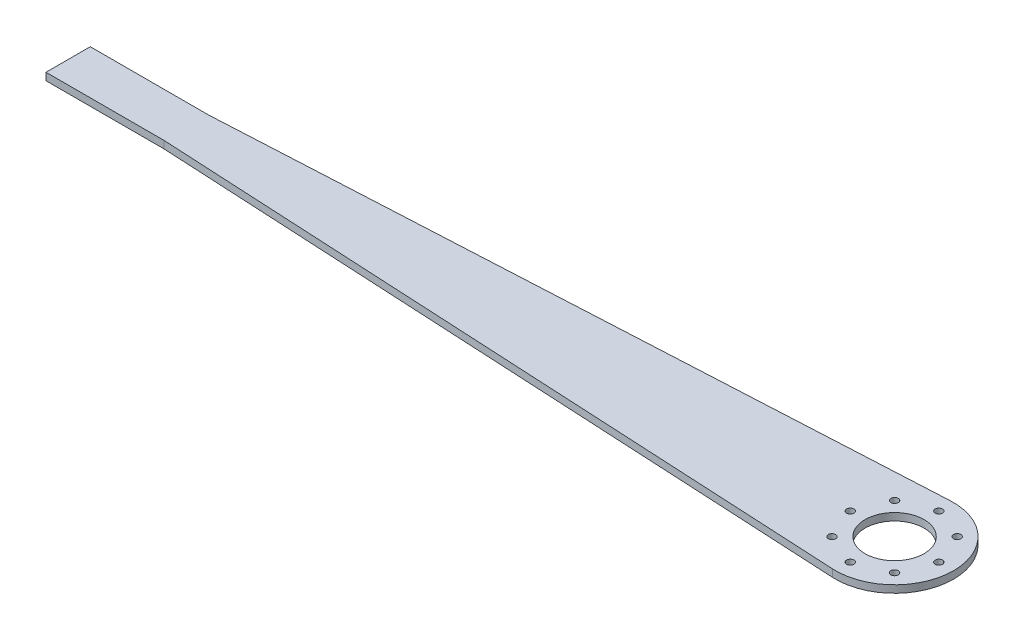
ISO-10303-21;
HEADER;
FILE_DESCRIPTION(('STEP AP214'),'2;1');
FILE_NAME('part.step','',(''),(''),'','','');
FILE_SCHEMA(('AUTOMOTIVE_DESIGN { 1 0 10303 214 1 1 1 1 }'));
ENDSEC;
DATA;
#1=APPLICATION_CONTEXT('core data for automotive mechanical design processes');
#2=APPLICATION_PROTOCOL_DEFINITION('international standard','automotive_design',2000,#1);
#3=PRODUCT_CONTEXT('',#1,'mechanical');
#4=PRODUCT('Part','Part','',(#3));
#5=PRODUCT_RELATED_PRODUCT_CATEGORY('part','',(#4));
#6=PRODUCT_DEFINITION_FORMATION('','',#4);
#7=PRODUCT_DEFINITION_CONTEXT('part definition',#1,'design');
#8=PRODUCT_DEFINITION('design','',#6,#7);
#9=PRODUCT_DEFINITION_SHAPE('','',#8);
#10=(LENGTH_UNIT() NAMED_UNIT(*) SI_UNIT(.MILLI.,.METRE.));
#11=(NAMED_UNIT(*) PLANE_ANGLE_UNIT() SI_UNIT($,.RADIAN.));
#12=(NAMED_UNIT(*) SI_UNIT($,.STERADIAN.) SOLID_ANGLE_UNIT());
#13=UNCERTAINTY_MEASURE_WITH_UNIT(LENGTH_MEASURE(1.E-05),#10,'distance_accuracy_value','');
#14=(GEOMETRIC_REPRESENTATION_CONTEXT(3) GLOBAL_UNCERTAINTY_ASSIGNED_CONTEXT((#13)) GLOBAL_UNIT_ASSIGNED_CONTEXT((#10,
#11,#12)) REPRESENTATION_CONTEXT('',''));
#15=CARTESIAN_POINT('',(0.,0.,0.));
#16=DIRECTION('',(0.,0.,1.));
#17=DIRECTION('',(1.,0.,0.));
#18=AXIS2_PLACEMENT_3D('',#15,#16,#17);
#19=CARTESIAN_POINT('',(-944.944647828686,6.35,-11.0296410004954));
#20=DIRECTION('',(0.,-1.,0.));
#21=DIRECTION('',(0.,0.,-1.));
#22=AXIS2_PLACEMENT_3D('',#19,#20,#21);
#23=CYLINDRICAL_SURFACE('',#22,50.8);
#24=CARTESIAN_POINT('',(-944.944647828686,0.,-11.0296410004954));
#25=DIRECTION('',(0.,1.,0.));
#26=DIRECTION('',(0.,0.,-1.));
#27=AXIS2_PLACEMENT_3D('',#24,#25,#26);
#28=CIRCLE('',#27,50.8);
#29=CARTESIAN_POINT('',(-947.592639327756,0.,39.7012976959337));
#30=VERTEX_POINT('',#29);
#31=CARTESIAN_POINT('',(-947.592639327756,0.,-61.7605796969246));
#32=VERTEX_POINT('',#31);
#33=EDGE_CURVE('E123',#30,#32,#28,.T.);
#34=ORIENTED_EDGE('',*,*,#33,.T.);
#35=DIRECTION('',(0.,-1.,0.));
#36=VECTOR('',#35,1.);
#37=CARTESIAN_POINT('',(-947.592639327756,6.35,-61.7605796969246));
#38=LINE('',#37,#36);
#39=CARTESIAN_POINT('',(-947.592639327756,6.35,-61.7605796969246));
#40=VERTEX_POINT('',#39);
#41=EDGE_CURVE('E11',#40,#32,#38,.T.);
#42=ORIENTED_EDGE('',*,*,#41,.F.);
#43=CARTESIAN_POINT('',(-944.944647828686,6.35,-11.0296410004954));
#44=DIRECTION('',(0.,1.,0.));
#45=DIRECTION('',(0.,0.,-1.));
#46=AXIS2_PLACEMENT_3D('',#43,#44,#45);
#47=CIRCLE('',#46,50.8);
#48=CARTESIAN_POINT('',(-947.592639327756,6.35,39.7012976959337));
#49=VERTEX_POINT('',#48);
#50=EDGE_CURVE('E134',#49,#40,#47,.T.);
#51=ORIENTED_EDGE('',*,*,#50,.F.);
#52=DIRECTION('',(0.,-1.,0.));
#53=VECTOR('',#52,1.);
#54=CARTESIAN_POINT('',(-947.592639327756,6.35,39.7012976959337));
#55=LINE('',#54,#53);
#56=EDGE_CURVE('E119',#49,#30,#55,.T.);
#57=ORIENTED_EDGE('',*,*,#56,.T.);
#58=EDGE_LOOP('',(#34,#42,#51,#57));
#59=FACE_BOUND('',#58,.T.);
#60=ADVANCED_FACE('F39',(#59),#23,.T.);
#61=CARTESIAN_POINT('',(-947.592639327756,6.35,-61.7605796969246));
#62=DIRECTION('',(0.0521258169108252,0.,0.998640525520259));
#63=DIRECTION('',(0.998640525520259,0.,-0.0521258169108252));
#64=AXIS2_PLACEMENT_3D('',#61,#62,#63);
#65=PLANE('',#64);
#66=DIRECTION('',(-0.998640525520259,0.,0.0521258169108252));
#67=VECTOR('',#66,1.);
#68=CARTESIAN_POINT('',(-947.592639327756,0.,-61.7605796969246));
#69=LINE('',#68,#67);
#70=CARTESIAN_POINT('',(-1554.54464782869,0.,-30.0796410004955));
#71=VERTEX_POINT('',#70);
#72=EDGE_CURVE('E126',#32,#71,#69,.T.);
#73=ORIENTED_EDGE('',*,*,#72,.T.);
#74=DIRECTION('',(0.,-1.,0.));
#75=VECTOR('',#74,1.);
#76=CARTESIAN_POINT('',(-1554.54464782869,6.35,-30.0796410004955));
#77=LINE('',#76,#75);
#78=CARTESIAN_POINT('',(-1554.54464782869,6.35,-30.0796410004955));
#79=VERTEX_POINT('',#78);
#80=EDGE_CURVE('E47',#79,#71,#77,.T.);
#81=ORIENTED_EDGE('',*,*,#80,.F.);
#82=DIRECTION('',(-0.998640525520259,0.,0.0521258169108252));
#83=VECTOR('',#82,1.);
#84=CARTESIAN_POINT('',(-947.592639327756,6.35,-61.7605796969246));
#85=LINE('',#84,#83);
#86=EDGE_CURVE('E92',#40,#79,#85,.T.);
#87=ORIENTED_EDGE('',*,*,#86,.F.);
#88=ORIENTED_EDGE('',*,*,#41,.T.);
#89=EDGE_LOOP('',(#73,#81,#87,#88));
#90=FACE_BOUND('',#89,.T.);
#91=ADVANCED_FACE('F160',(#90),#65,.F.);
#92=CARTESIAN_POINT('',(-1554.54464782869,6.35,-30.0796410004955));
#93=DIRECTION('',(0.,0.,1.));
#94=DIRECTION('',(1.,0.,0.));
#95=AXIS2_PLACEMENT_3D('',#92,#93,#94);
#96=PLANE('',#95);
#97=DIRECTION('',(-1.,0.,0.));
#98=VECTOR('',#97,1.);
#99=CARTESIAN_POINT('',(-1554.54464782869,0.,-30.0796410004955));
#100=LINE('',#99,#98);
#101=CARTESIAN_POINT('',(-1656.14464782869,0.,-30.0796410004954));
#102=VERTEX_POINT('',#101);
#103=EDGE_CURVE('E129',#71,#102,#100,.T.);
#104=ORIENTED_EDGE('',*,*,#103,.T.);
#105=DIRECTION('',(0.,-1.,0.));
#106=VECTOR('',#105,1.);
#107=CARTESIAN_POINT('',(-1656.14464782869,6.35,-30.0796410004954));
#108=LINE('',#107,#106);
#109=CARTESIAN_POINT('',(-1656.14464782869,6.35,-30.0796410004954));
#110=VERTEX_POINT('',#109);
#111=EDGE_CURVE('E114',#110,#102,#108,.T.);
#112=ORIENTED_EDGE('',*,*,#111,.F.);
#113=DIRECTION('',(-1.,0.,0.));
#114=VECTOR('',#113,1.);
#115=CARTESIAN_POINT('',(-1554.54464782869,6.35,-30.0796410004955));
#116=LINE('',#115,#114);
#117=EDGE_CURVE('E105',#79,#110,#116,.T.);
#118=ORIENTED_EDGE('',*,*,#117,.F.);
#119=ORIENTED_EDGE('',*,*,#80,.T.);
#120=EDGE_LOOP('',(#104,#112,#118,#119));
#121=FACE_BOUND('',#120,.T.);
#122=ADVANCED_FACE('F140',(#121),#96,.F.);
#123=CARTESIAN_POINT('',(-1656.14464782869,6.35,-30.0796410004954));
#124=DIRECTION('',(1.,0.,0.));
#125=DIRECTION('',(0.,0.,-1.));
#126=AXIS2_PLACEMENT_3D('',#123,#124,#125);
#127=PLANE('',#126);
#128=DIRECTION('',(0.,0.,1.));
#129=VECTOR('',#128,1.);
#130=CARTESIAN_POINT('',(-1656.14464782869,0.,-30.0796410004954));
#131=LINE('',#130,#129);
#132=CARTESIAN_POINT('',(-1656.14464782869,0.,8.02035899950456));
#133=VERTEX_POINT('',#132);
#134=EDGE_CURVE('E113',#102,#133,#131,.T.);
#135=ORIENTED_EDGE('',*,*,#134,.T.);
#136=DIRECTION('',(0.,-1.,0.));
#137=VECTOR('',#136,1.);
#138=CARTESIAN_POINT('',(-1656.14464782869,6.35,8.02035899950456));
#139=LINE('',#138,#137);
#140=CARTESIAN_POINT('',(-1656.14464782869,6.35,8.02035899950456));
#141=VERTEX_POINT('',#140);
#142=EDGE_CURVE('E110',#141,#133,#139,.T.);
#143=ORIENTED_EDGE('',*,*,#142,.F.);
#144=DIRECTION('',(0.,0.,1.));
#145=VECTOR('',#144,1.);
#146=CARTESIAN_POINT('',(-1656.14464782869,6.35,-30.0796410004954));
#147=LINE('',#146,#145);
#148=EDGE_CURVE('E99',#110,#141,#147,.T.);
#149=ORIENTED_EDGE('',*,*,#148,.F.);
#150=ORIENTED_EDGE('',*,*,#111,.T.);
#151=EDGE_LOOP('',(#135,#143,#149,#150));
#152=FACE_BOUND('',#151,.T.);
#153=ADVANCED_FACE('F111',(#152),#127,.F.);
#154=CARTESIAN_POINT('',(-1656.14464782869,6.35,8.02035899950456));
#155=DIRECTION('',(0.,0.,-1.));
#156=DIRECTION('',(-1.,0.,0.));
#157=AXIS2_PLACEMENT_3D('',#154,#155,#156);
#158=PLANE('',#157);
#159=DIRECTION('',(1.,0.,0.));
#160=VECTOR('',#159,1.);
#161=CARTESIAN_POINT('',(-1656.14464782869,0.,8.02035899950456));
#162=LINE('',#161,#160);
#163=CARTESIAN_POINT('',(-1554.54464782869,0.,8.02035899950456));
#164=VERTEX_POINT('',#163);
#165=EDGE_CURVE('E78',#133,#164,#162,.T.);
#166=ORIENTED_EDGE('',*,*,#165,.T.);
#167=DIRECTION('',(0.,-1.,0.));
#168=VECTOR('',#167,1.);
#169=CARTESIAN_POINT('',(-1554.54464782869,6.35,8.02035899950456));
#170=LINE('',#169,#168);
#171=CARTESIAN_POINT('',(-1554.54464782869,6.35,8.02035899950456));
#172=VERTEX_POINT('',#171);
#173=EDGE_CURVE('E115',#172,#164,#170,.T.);
#174=ORIENTED_EDGE('',*,*,#173,.F.);
#175=DIRECTION('',(1.,0.,0.));
#176=VECTOR('',#175,1.);
#177=CARTESIAN_POINT('',(-1656.14464782869,6.35,8.02035899950456));
#178=LINE('',#177,#176);
#179=EDGE_CURVE('E103',#141,#172,#178,.T.);
#180=ORIENTED_EDGE('',*,*,#179,.F.);
#181=ORIENTED_EDGE('',*,*,#142,.T.);
#182=EDGE_LOOP('',(#166,#174,#180,#181));
#183=FACE_BOUND('',#182,.T.);
#184=ADVANCED_FACE('F117',(#183),#158,.F.);
#185=CARTESIAN_POINT('',(-1554.54464782869,6.35,8.02035899950456));
#186=DIRECTION('',(0.0521258169108252,0.,-0.998640525520259));
#187=DIRECTION('',(-0.998640525520259,0.,-0.0521258169108252));
#188=AXIS2_PLACEMENT_3D('',#185,#186,#187);
#189=PLANE('',#188);
#190=DIRECTION('',(0.998640525520259,0.,0.0521258169108252));
#191=VECTOR('',#190,1.);
#192=CARTESIAN_POINT('',(-1554.54464782869,0.,8.02035899950456));
#193=LINE('',#192,#191);
#194=EDGE_CURVE('E84',#164,#30,#193,.T.);
#195=ORIENTED_EDGE('',*,*,#194,.T.);
#196=ORIENTED_EDGE('',*,*,#56,.F.);
#197=DIRECTION('',(0.998640525520259,0.,0.0521258169108252));
#198=VECTOR('',#197,1.);
#199=CARTESIAN_POINT('',(-1554.54464782869,6.35,8.02035899950456));
#200=LINE('',#199,#198);
#201=EDGE_CURVE('E55',#172,#49,#200,.T.);
#202=ORIENTED_EDGE('',*,*,#201,.F.);
#203=ORIENTED_EDGE('',*,*,#173,.T.);
#204=EDGE_LOOP('',(#195,#196,#202,#203));
#205=FACE_BOUND('',#204,.T.);
#206=ADVANCED_FACE('F147',(#205),#189,.F.);
#207=CARTESIAN_POINT('',(-944.944647828686,6.35,-11.0296410004954));
#208=DIRECTION('',(0.,-1.,0.));
#209=DIRECTION('',(0.,0.,-1.));
#210=AXIS2_PLACEMENT_3D('',#207,#208,#209);
#211=PLANE('',#210);
#212=CARTESIAN_POINT('',(-983.044647828686,6.35,-11.0296410004952));
#213=DIRECTION('',(0.,1.,0.));
#214=DIRECTION('',(1.,0.,0.));
#215=AXIS2_PLACEMENT_3D('',#212,#213,#214);
#216=CIRCLE('',#215,3.17500000000004);
#217=CARTESIAN_POINT('',(-979.869647828686,6.35,-11.0296410004952));
#218=VERTEX_POINT('',#217);
#219=EDGE_CURVE('E269',#218,#218,#216,.T.);
#220=ORIENTED_EDGE('',*,*,#219,.F.);
#221=EDGE_LOOP('',(#220));
#222=FACE_BOUND('',#221,.T.);
#223=CARTESIAN_POINT('',(-971.885416191894,6.35,15.9111273627122));
#224=DIRECTION('',(0.,1.,0.));
#225=DIRECTION('',(0.707106781186544,0.,-0.707106781186551));
#226=AXIS2_PLACEMENT_3D('',#223,#224,#225);
#227=CIRCLE('',#226,3.17500000000004);
#228=CARTESIAN_POINT('',(-969.640352161627,6.35,13.6660633324448));
#229=VERTEX_POINT('',#228);
#230=EDGE_CURVE('E275',#229,#229,#227,.T.);
#231=ORIENTED_EDGE('',*,*,#230,.F.);
#232=EDGE_LOOP('',(#231));
#233=FACE_BOUND('',#232,.T.);
#234=CARTESIAN_POINT('',(-944.944647828686,6.35,27.0703589995046));
#235=DIRECTION('',(0.,1.,0.));
#236=DIRECTION('',(0.,0.,-1.));
#237=AXIS2_PLACEMENT_3D('',#234,#235,#236);
#238=CIRCLE('',#237,3.17500000000004);
#239=CARTESIAN_POINT('',(-944.944647828686,6.35,23.8953589995045));
#240=VERTEX_POINT('',#239);
#241=EDGE_CURVE('E282',#240,#240,#238,.T.);
#242=ORIENTED_EDGE('',*,*,#241,.F.);
#243=EDGE_LOOP('',(#242));
#244=FACE_BOUND('',#243,.T.);
#245=CARTESIAN_POINT('',(-918.003879465479,6.35,15.9111273627117));
#246=DIRECTION('',(0.,1.,0.));
#247=DIRECTION('',(-0.707106781186554,0.,-0.707106781186541));
#248=AXIS2_PLACEMENT_3D('',#245,#246,#247);
#249=CIRCLE('',#248,3.17500000000004);
#250=CARTESIAN_POINT('',(-920.248943495746,6.35,13.6660633324444));
#251=VERTEX_POINT('',#250);
#252=EDGE_CURVE('E288',#251,#251,#249,.T.);
#253=ORIENTED_EDGE('',*,*,#252,.F.);
#254=EDGE_LOOP('',(#253));
#255=FACE_BOUND('',#254,.T.);
#256=CARTESIAN_POINT('',(-906.844647828686,6.35,-11.0296410004959));
#257=DIRECTION('',(0.,1.,0.));
#258=DIRECTION('',(-1.,0.,0.));
#259=AXIS2_PLACEMENT_3D('',#256,#257,#258);
#260=CIRCLE('',#259,3.17500000000004);
#261=CARTESIAN_POINT('',(-910.019647828687,6.35,-11.0296410004958));
#262=VERTEX_POINT('',#261);
#263=EDGE_CURVE('E294',#262,#262,#260,.T.);
#264=ORIENTED_EDGE('',*,*,#263,.F.);
#265=EDGE_LOOP('',(#264));
#266=FACE_BOUND('',#265,.T.);
#267=CARTESIAN_POINT('',(-918.003879465479,6.35,-37.9704093637032));
#268=DIRECTION('',(0.,1.,0.));
#269=DIRECTION('',(-0.707106781186539,0.,0.707106781186556));
#270=AXIS2_PLACEMENT_3D('',#267,#268,#269);
#271=CIRCLE('',#270,3.17500000000004);
#272=CARTESIAN_POINT('',(-920.248943495747,6.35,-35.7253453334359));
#273=VERTEX_POINT('',#272);
#274=EDGE_CURVE('E333',#273,#273,#271,.T.);
#275=ORIENTED_EDGE('',*,*,#274,.F.);
#276=EDGE_LOOP('',(#275));
#277=FACE_BOUND('',#276,.T.);
#278=CARTESIAN_POINT('',(-971.885416191894,6.35,-37.9704093637029));
#279=DIRECTION('',(0.,1.,0.));
#280=DIRECTION('',(0.707106781186549,0.,0.707106781186546));
#281=AXIS2_PLACEMENT_3D('',#278,#279,#280);
#282=CIRCLE('',#281,3.17500000000004);
#283=CARTESIAN_POINT('',(-969.640352161627,6.35,-35.7253453334356));
#284=VERTEX_POINT('',#283);
#285=EDGE_CURVE('E273',#284,#284,#282,.T.);
#286=ORIENTED_EDGE('',*,*,#285,.F.);
#287=EDGE_LOOP('',(#286));
#288=FACE_BOUND('',#287,.T.);
#289=CARTESIAN_POINT('',(-944.944647828686,6.35,-49.1296410004954));
#290=DIRECTION('',(0.,1.,0.));
#291=DIRECTION('',(0.,0.,1.));
#292=AXIS2_PLACEMENT_3D('',#289,#290,#291);
#293=CIRCLE('',#292,3.17500000000004);
#294=CARTESIAN_POINT('',(-944.944647828686,6.35,-45.9546410004954));
#295=VERTEX_POINT('',#294);
#296=EDGE_CURVE('E299',#295,#295,#293,.T.);
#297=ORIENTED_EDGE('',*,*,#296,.F.);
#298=EDGE_LOOP('',(#297));
#299=FACE_BOUND('',#298,.T.);
#300=CARTESIAN_POINT('',(-944.944647828686,6.35,-11.0296410004954));
#301=DIRECTION('',(0.,1.,0.));
#302=DIRECTION('',(0.,0.,1.));
#303=AXIS2_PLACEMENT_3D('',#300,#301,#302);
#304=CIRCLE('',#303,25.4);
#305=CARTESIAN_POINT('',(-944.944647828686,6.35,14.3703589995045));
#306=VERTEX_POINT('',#305);
#307=EDGE_CURVE('E305',#306,#306,#304,.T.);
#308=ORIENTED_EDGE('',*,*,#307,.F.);
#309=EDGE_LOOP('',(#308));
#310=FACE_BOUND('',#309,.T.);
#311=ORIENTED_EDGE('',*,*,#50,.T.);
#312=ORIENTED_EDGE('',*,*,#86,.T.);
#313=ORIENTED_EDGE('',*,*,#117,.T.);
#314=ORIENTED_EDGE('',*,*,#148,.T.);
#315=ORIENTED_EDGE('',*,*,#179,.T.);
#316=ORIENTED_EDGE('',*,*,#201,.T.);
#317=EDGE_LOOP('',(#311,#312,#313,#314,#315,#316));
#318=FACE_BOUND('',#317,.T.);
#319=ADVANCED_FACE('F101',(#222,#233,#244,#255,#266,#277,#288,#299,#310,#318),#211,.F.);
#320=CARTESIAN_POINT('',(-944.944647828686,0.,-11.0296410004954));
#321=DIRECTION('',(0.,-1.,0.));
#322=DIRECTION('',(0.,0.,-1.));
#323=AXIS2_PLACEMENT_3D('',#320,#321,#322);
#324=PLANE('',#323);
#325=CARTESIAN_POINT('',(-983.044647828686,0.,-11.0296410004952));
#326=DIRECTION('',(0.,1.,0.));
#327=DIRECTION('',(1.,0.,0.));
#328=AXIS2_PLACEMENT_3D('',#325,#326,#327);
#329=CIRCLE('',#328,3.17500000000004);
#330=CARTESIAN_POINT('',(-979.869647828686,0.,-11.0296410004952));
#331=VERTEX_POINT('',#330);
#332=EDGE_CURVE('E266',#331,#331,#329,.T.);
#333=ORIENTED_EDGE('',*,*,#332,.T.);
#334=EDGE_LOOP('',(#333));
#335=FACE_BOUND('',#334,.T.);
#336=CARTESIAN_POINT('',(-971.885416191894,0.,15.9111273627122));
#337=DIRECTION('',(0.,1.,0.));
#338=DIRECTION('',(0.707106781186544,0.,-0.707106781186551));
#339=AXIS2_PLACEMENT_3D('',#336,#337,#338);
#340=CIRCLE('',#339,3.17500000000004);
#341=CARTESIAN_POINT('',(-969.640352161627,0.,13.6660633324448));
#342=VERTEX_POINT('',#341);
#343=EDGE_CURVE('E279',#342,#342,#340,.T.);
#344=ORIENTED_EDGE('',*,*,#343,.T.);
#345=EDGE_LOOP('',(#344));
#346=FACE_BOUND('',#345,.T.);
#347=CARTESIAN_POINT('',(-944.944647828686,0.,27.0703589995046));
#348=DIRECTION('',(0.,1.,0.));
#349=DIRECTION('',(0.,0.,-1.));
#350=AXIS2_PLACEMENT_3D('',#347,#348,#349);
#351=CIRCLE('',#350,3.17500000000004);
#352=CARTESIAN_POINT('',(-944.944647828686,0.,23.8953589995045));
#353=VERTEX_POINT('',#352);
#354=EDGE_CURVE('E285',#353,#353,#351,.T.);
#355=ORIENTED_EDGE('',*,*,#354,.T.);
#356=EDGE_LOOP('',(#355));
#357=FACE_BOUND('',#356,.T.);
#358=CARTESIAN_POINT('',(-918.003879465479,0.,15.9111273627117));
#359=DIRECTION('',(0.,1.,0.));
#360=DIRECTION('',(-0.707106781186554,0.,-0.707106781186541));
#361=AXIS2_PLACEMENT_3D('',#358,#359,#360);
#362=CIRCLE('',#361,3.17500000000004);
#363=CARTESIAN_POINT('',(-920.248943495746,0.,13.6660633324444));
#364=VERTEX_POINT('',#363);
#365=EDGE_CURVE('E291',#364,#364,#362,.T.);
#366=ORIENTED_EDGE('',*,*,#365,.T.);
#367=EDGE_LOOP('',(#366));
#368=FACE_BOUND('',#367,.T.);
#369=CARTESIAN_POINT('',(-906.844647828686,0.,-11.0296410004959));
#370=DIRECTION('',(0.,1.,0.));
#371=DIRECTION('',(-1.,0.,0.));
#372=AXIS2_PLACEMENT_3D('',#369,#370,#371);
#373=CIRCLE('',#372,3.17500000000004);
#374=CARTESIAN_POINT('',(-910.019647828687,0.,-11.0296410004958));
#375=VERTEX_POINT('',#374);
#376=EDGE_CURVE('E335',#375,#375,#373,.T.);
#377=ORIENTED_EDGE('',*,*,#376,.T.);
#378=EDGE_LOOP('',(#377));
#379=FACE_BOUND('',#378,.T.);
#380=CARTESIAN_POINT('',(-918.003879465479,0.,-37.9704093637032));
#381=DIRECTION('',(0.,1.,0.));
#382=DIRECTION('',(-0.707106781186539,0.,0.707106781186556));
#383=AXIS2_PLACEMENT_3D('',#380,#381,#382);
#384=CIRCLE('',#383,3.17500000000004);
#385=CARTESIAN_POINT('',(-920.248943495747,0.,-35.7253453334359));
#386=VERTEX_POINT('',#385);
#387=EDGE_CURVE('E336',#386,#386,#384,.T.);
#388=ORIENTED_EDGE('',*,*,#387,.T.);
#389=EDGE_LOOP('',(#388));
#390=FACE_BOUND('',#389,.T.);
#391=CARTESIAN_POINT('',(-971.885416191894,0.,-37.9704093637029));
#392=DIRECTION('',(0.,1.,0.));
#393=DIRECTION('',(0.707106781186549,0.,0.707106781186546));
#394=AXIS2_PLACEMENT_3D('',#391,#392,#393);
#395=CIRCLE('',#394,3.17500000000004);
#396=CARTESIAN_POINT('',(-969.640352161627,0.,-35.7253453334356));
#397=VERTEX_POINT('',#396);
#398=EDGE_CURVE('E270',#397,#397,#395,.T.);
#399=ORIENTED_EDGE('',*,*,#398,.T.);
#400=EDGE_LOOP('',(#399));
#401=FACE_BOUND('',#400,.T.);
#402=CARTESIAN_POINT('',(-944.944647828686,0.,-49.1296410004954));
#403=DIRECTION('',(0.,1.,0.));
#404=DIRECTION('',(0.,0.,1.));
#405=AXIS2_PLACEMENT_3D('',#402,#403,#404);
#406=CIRCLE('',#405,3.17500000000004);
#407=CARTESIAN_POINT('',(-944.944647828686,0.,-45.9546410004954));
#408=VERTEX_POINT('',#407);
#409=EDGE_CURVE('E302',#408,#408,#406,.T.);
#410=ORIENTED_EDGE('',*,*,#409,.T.);
#411=EDGE_LOOP('',(#410));
#412=FACE_BOUND('',#411,.T.);
#413=CARTESIAN_POINT('',(-944.944647828686,0.,-11.0296410004954));
#414=DIRECTION('',(0.,1.,0.));
#415=DIRECTION('',(0.,0.,1.));
#416=AXIS2_PLACEMENT_3D('',#413,#414,#415);
#417=CIRCLE('',#416,25.4);
#418=CARTESIAN_POINT('',(-944.944647828686,0.,14.3703589995045));
#419=VERTEX_POINT('',#418);
#420=EDGE_CURVE('E127',#419,#419,#417,.T.);
#421=ORIENTED_EDGE('',*,*,#420,.T.);
#422=EDGE_LOOP('',(#421));
#423=FACE_BOUND('',#422,.T.);
#424=ORIENTED_EDGE('',*,*,#33,.F.);
#425=ORIENTED_EDGE('',*,*,#194,.F.);
#426=ORIENTED_EDGE('',*,*,#165,.F.);
#427=ORIENTED_EDGE('',*,*,#134,.F.);
#428=ORIENTED_EDGE('',*,*,#103,.F.);
#429=ORIENTED_EDGE('',*,*,#72,.F.);
#430=EDGE_LOOP('',(#424,#425,#426,#427,#428,#429));
#431=FACE_BOUND('',#430,.T.);
#432=ADVANCED_FACE('F143',(#335,#346,#357,#368,#379,#390,#401,#412,#423,#431),#324,.T.);
#433=CARTESIAN_POINT('',(-944.944647828686,0.,-11.0296410004954));
#434=DIRECTION('',(0.,1.,0.));
#435=DIRECTION('',(0.,0.,1.));
#436=AXIS2_PLACEMENT_3D('',#433,#434,#435);
#437=CYLINDRICAL_SURFACE('',#436,25.4);
#438=ORIENTED_EDGE('',*,*,#420,.F.);
#439=EDGE_LOOP('',(#438));
#440=FACE_BOUND('',#439,.T.);
#441=ORIENTED_EDGE('',*,*,#307,.T.);
#442=EDGE_LOOP('',(#441));
#443=FACE_BOUND('',#442,.T.);
#444=ADVANCED_FACE('F192',(#440,#443),#437,.F.);
#445=CARTESIAN_POINT('',(-944.944647828686,6.35,-49.1296410004954));
#446=DIRECTION('',(0.,1.,0.));
#447=DIRECTION('',(0.,0.,1.));
#448=AXIS2_PLACEMENT_3D('',#445,#446,#447);
#449=CYLINDRICAL_SURFACE('',#448,3.17500000000004);
#450=ORIENTED_EDGE('',*,*,#409,.F.);
#451=EDGE_LOOP('',(#450));
#452=FACE_BOUND('',#451,.T.);
#453=ORIENTED_EDGE('',*,*,#296,.T.);
#454=EDGE_LOOP('',(#453));
#455=FACE_BOUND('',#454,.T.);
#456=ADVANCED_FACE('F199',(#452,#455),#449,.F.);
#457=CARTESIAN_POINT('',(-971.885416191894,6.35,-37.9704093637029));
#458=DIRECTION('',(0.,1.,0.));
#459=DIRECTION('',(0.707106781186549,0.,0.707106781186546));
#460=AXIS2_PLACEMENT_3D('',#457,#458,#459);
#461=CYLINDRICAL_SURFACE('',#460,3.17500000000004);
#462=ORIENTED_EDGE('',*,*,#398,.F.);
#463=EDGE_LOOP('',(#462));
#464=FACE_BOUND('',#463,.T.);
#465=ORIENTED_EDGE('',*,*,#285,.T.);
#466=EDGE_LOOP('',(#465));
#467=FACE_BOUND('',#466,.T.);
#468=ADVANCED_FACE('F206',(#464,#467),#461,.F.);
#469=CARTESIAN_POINT('',(-918.003879465479,6.35,-37.9704093637032));
#470=DIRECTION('',(0.,1.,0.));
#471=DIRECTION('',(-0.707106781186539,0.,0.707106781186556));
#472=AXIS2_PLACEMENT_3D('',#469,#470,#471);
#473=CYLINDRICAL_SURFACE('',#472,3.17500000000004);
#474=ORIENTED_EDGE('',*,*,#387,.F.);
#475=EDGE_LOOP('',(#474));
#476=FACE_BOUND('',#475,.T.);
#477=ORIENTED_EDGE('',*,*,#274,.T.);
#478=EDGE_LOOP('',(#477));
#479=FACE_BOUND('',#478,.T.);
#480=ADVANCED_FACE('F213',(#476,#479),#473,.F.);
#481=CARTESIAN_POINT('',(-906.844647828686,6.35,-11.0296410004959));
#482=DIRECTION('',(0.,1.,0.));
#483=DIRECTION('',(-1.,0.,0.));
#484=AXIS2_PLACEMENT_3D('',#481,#482,#483);
#485=CYLINDRICAL_SURFACE('',#484,3.17500000000004);
#486=ORIENTED_EDGE('',*,*,#376,.F.);
#487=EDGE_LOOP('',(#486));
#488=FACE_BOUND('',#487,.T.);
#489=ORIENTED_EDGE('',*,*,#263,.T.);
#490=EDGE_LOOP('',(#489));
#491=FACE_BOUND('',#490,.T.);
#492=ADVANCED_FACE('F221',(#488,#491),#485,.F.);
#493=CARTESIAN_POINT('',(-918.003879465479,6.35,15.9111273627117));
#494=DIRECTION('',(0.,1.,0.));
#495=DIRECTION('',(-0.707106781186554,0.,-0.707106781186541));
#496=AXIS2_PLACEMENT_3D('',#493,#494,#495);
#497=CYLINDRICAL_SURFACE('',#496,3.17500000000004);
#498=ORIENTED_EDGE('',*,*,#365,.F.);
#499=EDGE_LOOP('',(#498));
#500=FACE_BOUND('',#499,.T.);
#501=ORIENTED_EDGE('',*,*,#252,.T.);
#502=EDGE_LOOP('',(#501));
#503=FACE_BOUND('',#502,.T.);
#504=ADVANCED_FACE('F229',(#500,#503),#497,.F.);
#505=CARTESIAN_POINT('',(-944.944647828686,6.35,27.0703589995046));
#506=DIRECTION('',(0.,1.,0.));
#507=DIRECTION('',(0.,0.,-1.));
#508=AXIS2_PLACEMENT_3D('',#505,#506,#507);
#509=CYLINDRICAL_SURFACE('',#508,3.17500000000004);
#510=ORIENTED_EDGE('',*,*,#354,.F.);
#511=EDGE_LOOP('',(#510));
#512=FACE_BOUND('',#511,.T.);
#513=ORIENTED_EDGE('',*,*,#241,.T.);
#514=EDGE_LOOP('',(#513));
#515=FACE_BOUND('',#514,.T.);
#516=ADVANCED_FACE('F237',(#512,#515),#509,.F.);
#517=CARTESIAN_POINT('',(-971.885416191894,6.35,15.9111273627122));
#518=DIRECTION('',(0.,1.,0.));
#519=DIRECTION('',(0.707106781186544,0.,-0.707106781186551));
#520=AXIS2_PLACEMENT_3D('',#517,#518,#519);
#521=CYLINDRICAL_SURFACE('',#520,3.17500000000004);
#522=ORIENTED_EDGE('',*,*,#343,.F.);
#523=EDGE_LOOP('',(#522));
#524=FACE_BOUND('',#523,.T.);
#525=ORIENTED_EDGE('',*,*,#230,.T.);
#526=EDGE_LOOP('',(#525));
#527=FACE_BOUND('',#526,.T.);
#528=ADVANCED_FACE('F245',(#524,#527),#521,.F.);
#529=CARTESIAN_POINT('',(-983.044647828686,6.35,-11.0296410004952));
#530=DIRECTION('',(0.,1.,0.));
#531=DIRECTION('',(1.,0.,0.));
#532=AXIS2_PLACEMENT_3D('',#529,#530,#531);
#533=CYLINDRICAL_SURFACE('',#532,3.17500000000004);
#534=ORIENTED_EDGE('',*,*,#332,.F.);
#535=EDGE_LOOP('',(#534));
#536=FACE_BOUND('',#535,.T.);
#537=ORIENTED_EDGE('',*,*,#219,.T.);
#538=EDGE_LOOP('',(#537));
#539=FACE_BOUND('',#538,.T.);
#540=ADVANCED_FACE('F253',(#536,#539),#533,.F.);
#541=CLOSED_SHELL('',(#60,#91,#122,#153,#184,#206,#319,#432,#444,#456,#468,#480,#492,#504,#516,
#528,#540));
#542=MANIFOLD_SOLID_BREP('B2',#541);
#543=ADVANCED_BREP_SHAPE_REPRESENTATION('',(#18,#542),#14);
#544=SHAPE_DEFINITION_REPRESENTATION(#9,#543);
ENDSEC;
END-ISO-10303-21;
